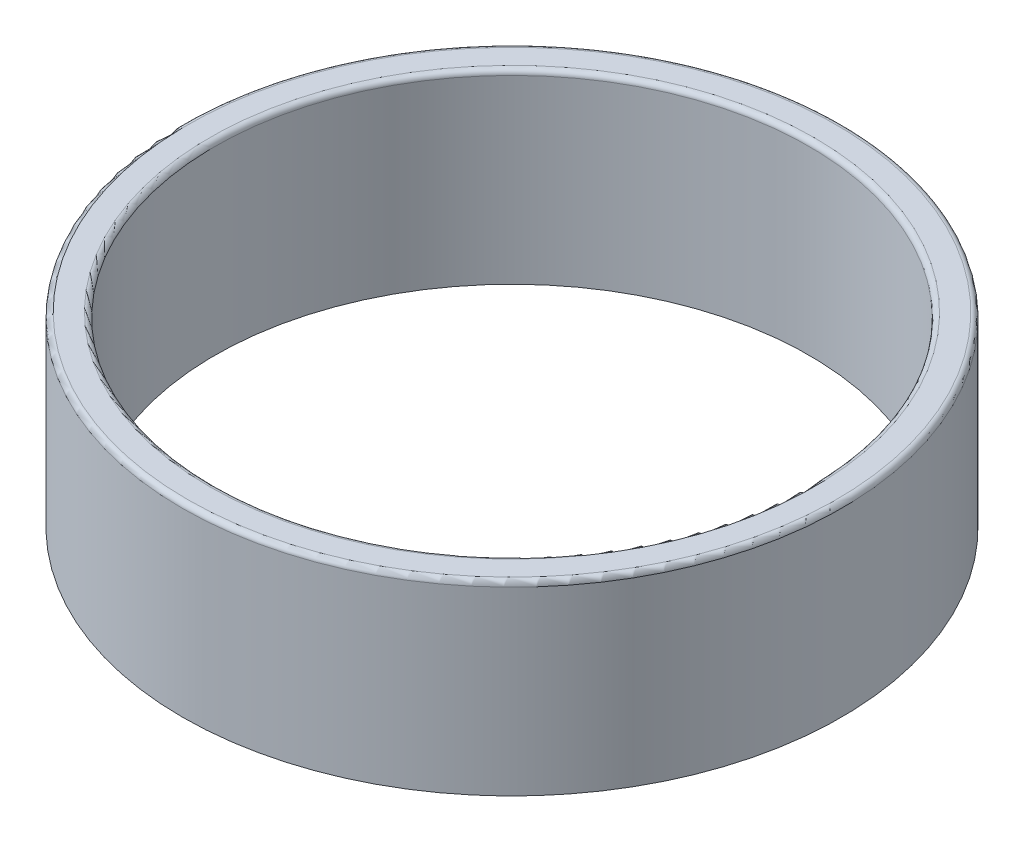
ISO-10303-21;
HEADER;
FILE_DESCRIPTION(('STEP AP214'),'2;1');
FILE_NAME('part.step','',(''),(''),'','','');
FILE_SCHEMA(('AUTOMOTIVE_DESIGN { 1 0 10303 214 1 1 1 1 }'));
ENDSEC;
DATA;
#1=APPLICATION_CONTEXT('core data for automotive mechanical design processes');
#2=APPLICATION_PROTOCOL_DEFINITION('international standard','automotive_design',2000,#1);
#3=PRODUCT_CONTEXT('',#1,'mechanical');
#4=PRODUCT('Part','Part','',(#3));
#5=PRODUCT_RELATED_PRODUCT_CATEGORY('part','',(#4));
#6=PRODUCT_DEFINITION_FORMATION('','',#4);
#7=PRODUCT_DEFINITION_CONTEXT('part definition',#1,'design');
#8=PRODUCT_DEFINITION('design','',#6,#7);
#9=PRODUCT_DEFINITION_SHAPE('','',#8);
#10=(LENGTH_UNIT() NAMED_UNIT(*) SI_UNIT(.MILLI.,.METRE.));
#11=(NAMED_UNIT(*) PLANE_ANGLE_UNIT() SI_UNIT($,.RADIAN.));
#12=(NAMED_UNIT(*) SI_UNIT($,.STERADIAN.) SOLID_ANGLE_UNIT());
#13=UNCERTAINTY_MEASURE_WITH_UNIT(LENGTH_MEASURE(1.E-05),#10,'distance_accuracy_value','');
#14=(GEOMETRIC_REPRESENTATION_CONTEXT(3) GLOBAL_UNCERTAINTY_ASSIGNED_CONTEXT((#13)) GLOBAL_UNIT_ASSIGNED_CONTEXT((#10,
#11,#12)) REPRESENTATION_CONTEXT('',''));
#15=CARTESIAN_POINT('',(0.,0.,0.));
#16=DIRECTION('',(0.,0.,1.));
#17=DIRECTION('',(1.,0.,0.));
#18=AXIS2_PLACEMENT_3D('',#15,#16,#17);
#19=CARTESIAN_POINT('',(0.,23.0886,0.));
#20=DIRECTION('',(0.,1.,0.));
#21=DIRECTION('',(0.,0.,1.));
#22=AXIS2_PLACEMENT_3D('',#19,#20,#21);
#23=PLANE('',#22);
#24=CARTESIAN_POINT('',(0.,23.0886,0.));
#25=DIRECTION('',(0.,1.,0.));
#26=DIRECTION('',(0.,0.,1.));
#27=AXIS2_PLACEMENT_3D('',#24,#25,#26);
#28=CIRCLE('',#27,37.5412);
#29=CARTESIAN_POINT('',(0.,23.0886,37.5412));
#30=VERTEX_POINT('',#29);
#31=EDGE_CURVE('E38',#30,#30,#28,.F.);
#32=ORIENTED_EDGE('',*,*,#31,.T.);
#33=EDGE_LOOP('',(#32));
#34=FACE_BOUND('',#33,.T.);
#35=CARTESIAN_POINT('',(0.,23.0886,0.));
#36=DIRECTION('',(0.,1.,0.));
#37=DIRECTION('',(0.,0.,1.));
#38=AXIS2_PLACEMENT_3D('',#35,#36,#37);
#39=CIRCLE('',#38,40.2844);
#40=CARTESIAN_POINT('',(0.,23.0886,40.2844));
#41=VERTEX_POINT('',#40);
#42=EDGE_CURVE('E42',#41,#41,#39,.T.);
#43=ORIENTED_EDGE('',*,*,#42,.T.);
#44=EDGE_LOOP('',(#43));
#45=FACE_BOUND('',#44,.T.);
#46=ADVANCED_FACE('F31',(#34,#45),#23,.T.);
#47=CARTESIAN_POINT('',(0.,0.,0.));
#48=DIRECTION('',(0.,1.,0.));
#49=DIRECTION('',(0.,0.,1.));
#50=AXIS2_PLACEMENT_3D('',#47,#48,#49);
#51=PLANE('',#50);
#52=CARTESIAN_POINT('',(0.,0.,0.));
#53=DIRECTION('',(0.,1.,0.));
#54=DIRECTION('',(0.,0.,1.));
#55=AXIS2_PLACEMENT_3D('',#52,#53,#54);
#56=CIRCLE('',#55,40.9194);
#57=CARTESIAN_POINT('',(0.,0.,40.9194));
#58=VERTEX_POINT('',#57);
#59=EDGE_CURVE('E51',#58,#58,#56,.T.);
#60=ORIENTED_EDGE('',*,*,#59,.F.);
#61=EDGE_LOOP('',(#60));
#62=FACE_BOUND('',#61,.T.);
#63=CARTESIAN_POINT('',(0.,0.,0.));
#64=DIRECTION('',(0.,1.,0.));
#65=DIRECTION('',(0.,0.,1.));
#66=AXIS2_PLACEMENT_3D('',#63,#64,#65);
#67=CIRCLE('',#66,36.9062);
#68=CARTESIAN_POINT('',(0.,0.,36.9062));
#69=VERTEX_POINT('',#68);
#70=EDGE_CURVE('E54',#69,#69,#67,.T.);
#71=ORIENTED_EDGE('',*,*,#70,.T.);
#72=EDGE_LOOP('',(#71));
#73=FACE_BOUND('',#72,.T.);
#74=ADVANCED_FACE('F58',(#62,#73),#51,.F.);
#75=CARTESIAN_POINT('',(0.,23.0886,0.));
#76=DIRECTION('',(0.,-1.,0.));
#77=DIRECTION('',(0.,0.,-1.));
#78=AXIS2_PLACEMENT_3D('',#75,#76,#77);
#79=CYLINDRICAL_SURFACE('',#78,40.9194);
#80=CARTESIAN_POINT('',(0.,22.4536,0.));
#81=DIRECTION('',(0.,1.,0.));
#82=DIRECTION('',(0.,0.,1.));
#83=AXIS2_PLACEMENT_3D('',#80,#81,#82);
#84=CIRCLE('',#83,40.9194);
#85=CARTESIAN_POINT('',(0.,22.4536,40.9194));
#86=VERTEX_POINT('',#85);
#87=EDGE_CURVE('E10',#86,#86,#84,.F.);
#88=ORIENTED_EDGE('',*,*,#87,.T.);
#89=EDGE_LOOP('',(#88));
#90=FACE_BOUND('',#89,.T.);
#91=ORIENTED_EDGE('',*,*,#59,.T.);
#92=EDGE_LOOP('',(#91));
#93=FACE_BOUND('',#92,.T.);
#94=ADVANCED_FACE('F63',(#90,#93),#79,.T.);
#95=CARTESIAN_POINT('',(0.,23.0886,0.));
#96=DIRECTION('',(0.,-1.,0.));
#97=DIRECTION('',(0.,0.,-1.));
#98=AXIS2_PLACEMENT_3D('',#95,#96,#97);
#99=CYLINDRICAL_SURFACE('',#98,36.9062);
#100=CARTESIAN_POINT('',(0.,22.4536,0.));
#101=DIRECTION('',(0.,1.,0.));
#102=DIRECTION('',(0.,0.,1.));
#103=AXIS2_PLACEMENT_3D('',#100,#101,#102);
#104=CIRCLE('',#103,36.9062);
#105=CARTESIAN_POINT('',(0.,22.4536,36.9062));
#106=VERTEX_POINT('',#105);
#107=EDGE_CURVE('E46',#106,#106,#104,.T.);
#108=ORIENTED_EDGE('',*,*,#107,.T.);
#109=EDGE_LOOP('',(#108));
#110=FACE_BOUND('',#109,.T.);
#111=ORIENTED_EDGE('',*,*,#70,.F.);
#112=EDGE_LOOP('',(#111));
#113=FACE_BOUND('',#112,.T.);
#114=ADVANCED_FACE('F60',(#110,#113),#99,.F.);
#115=CARTESIAN_POINT('',(0.,22.4536,0.));
#116=DIRECTION('',(0.,1.,0.));
#117=DIRECTION('',(0.,0.,1.));
#118=AXIS2_PLACEMENT_3D('',#115,#116,#117);
#119=TOROIDAL_SURFACE('',#118,37.5412,0.635);
#120=ORIENTED_EDGE('',*,*,#31,.F.);
#121=EDGE_LOOP('',(#120));
#122=FACE_BOUND('',#121,.T.);
#123=ORIENTED_EDGE('',*,*,#107,.F.);
#124=EDGE_LOOP('',(#123));
#125=FACE_BOUND('',#124,.T.);
#126=ADVANCED_FACE('F62',(#122,#125),#119,.T.);
#127=CARTESIAN_POINT('',(0.,22.4536,0.));
#128=DIRECTION('',(0.,1.,0.));
#129=DIRECTION('',(0.,0.,1.));
#130=AXIS2_PLACEMENT_3D('',#127,#128,#129);
#131=TOROIDAL_SURFACE('',#130,40.2844,0.635);
#132=ORIENTED_EDGE('',*,*,#87,.F.);
#133=EDGE_LOOP('',(#132));
#134=FACE_BOUND('',#133,.T.);
#135=ORIENTED_EDGE('',*,*,#42,.F.);
#136=EDGE_LOOP('',(#135));
#137=FACE_BOUND('',#136,.T.);
#138=ADVANCED_FACE('F33',(#134,#137),#131,.T.);
#139=CLOSED_SHELL('',(#46,#74,#94,#114,#126,#138));
#140=MANIFOLD_SOLID_BREP('B2',#139);
#141=ADVANCED_BREP_SHAPE_REPRESENTATION('',(#18,#140),#14);
#142=SHAPE_DEFINITION_REPRESENTATION(#9,#141);
ENDSEC;
END-ISO-10303-21;
